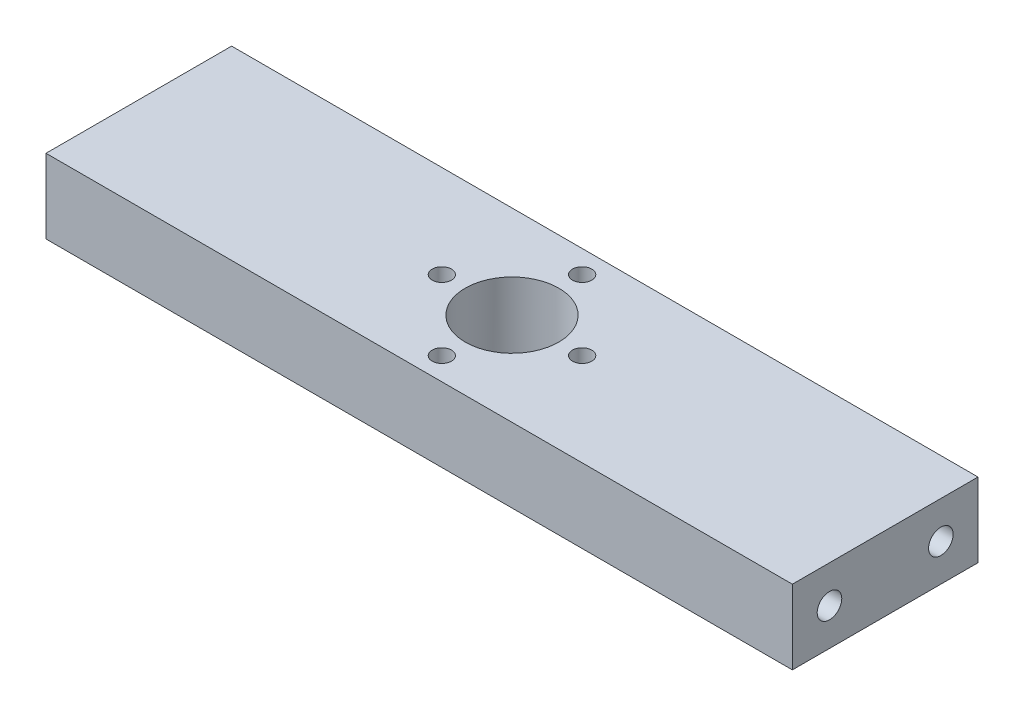
ISO-10303-21;
HEADER;
FILE_DESCRIPTION(('STEP AP214'),'2;1');
FILE_NAME('part.step','',(''),(''),'','','');
FILE_SCHEMA(('AUTOMOTIVE_DESIGN { 1 0 10303 214 1 1 1 1 }'));
ENDSEC;
DATA;
#1=APPLICATION_CONTEXT('core data for automotive mechanical design processes');
#2=APPLICATION_PROTOCOL_DEFINITION('international standard','automotive_design',2000,#1);
#3=PRODUCT_CONTEXT('',#1,'mechanical');
#4=PRODUCT('Part','Part','',(#3));
#5=PRODUCT_RELATED_PRODUCT_CATEGORY('part','',(#4));
#6=PRODUCT_DEFINITION_FORMATION('','',#4);
#7=PRODUCT_DEFINITION_CONTEXT('part definition',#1,'design');
#8=PRODUCT_DEFINITION('design','',#6,#7);
#9=PRODUCT_DEFINITION_SHAPE('','',#8);
#10=(LENGTH_UNIT() NAMED_UNIT(*) SI_UNIT(.MILLI.,.METRE.));
#11=(NAMED_UNIT(*) PLANE_ANGLE_UNIT() SI_UNIT($,.RADIAN.));
#12=(NAMED_UNIT(*) SI_UNIT($,.STERADIAN.) SOLID_ANGLE_UNIT());
#13=UNCERTAINTY_MEASURE_WITH_UNIT(LENGTH_MEASURE(1.E-05),#10,'distance_accuracy_value','');
#14=(GEOMETRIC_REPRESENTATION_CONTEXT(3) GLOBAL_UNCERTAINTY_ASSIGNED_CONTEXT((#13)) GLOBAL_UNIT_ASSIGNED_CONTEXT((#10,
#11,#12)) REPRESENTATION_CONTEXT('',''));
#15=CARTESIAN_POINT('',(0.,0.,0.));
#16=DIRECTION('',(0.,0.,1.));
#17=DIRECTION('',(1.,0.,0.));
#18=AXIS2_PLACEMENT_3D('',#15,#16,#17);
#19=CARTESIAN_POINT('',(0.,6.35,0.));
#20=DIRECTION('',(0.,-1.,0.));
#21=DIRECTION('',(0.,0.,-1.));
#22=AXIS2_PLACEMENT_3D('',#19,#20,#21);
#23=PLANE('',#22);
#24=CARTESIAN_POINT('',(0.,6.35,-12.));
#25=DIRECTION('',(0.,1.,0.));
#26=DIRECTION('',(0.,0.,1.));
#27=AXIS2_PLACEMENT_3D('',#24,#25,#26);
#28=CIRCLE('',#27,1.65);
#29=CARTESIAN_POINT('',(0.,6.35,-10.35));
#30=VERTEX_POINT('',#29);
#31=EDGE_CURVE('E205',#30,#30,#28,.T.);
#32=ORIENTED_EDGE('',*,*,#31,.F.);
#33=EDGE_LOOP('',(#32));
#34=FACE_BOUND('',#33,.T.);
#35=CARTESIAN_POINT('',(-12.,6.35,0.));
#36=DIRECTION('',(0.,1.,0.));
#37=DIRECTION('',(0.,0.,1.));
#38=AXIS2_PLACEMENT_3D('',#35,#36,#37);
#39=CIRCLE('',#38,1.65);
#40=CARTESIAN_POINT('',(-12.,6.35,1.65));
#41=VERTEX_POINT('',#40);
#42=EDGE_CURVE('E202',#41,#41,#39,.T.);
#43=ORIENTED_EDGE('',*,*,#42,.F.);
#44=EDGE_LOOP('',(#43));
#45=FACE_BOUND('',#44,.T.);
#46=CARTESIAN_POINT('',(0.,6.35,12.));
#47=DIRECTION('',(0.,1.,0.));
#48=DIRECTION('',(0.,0.,1.));
#49=AXIS2_PLACEMENT_3D('',#46,#47,#48);
#50=CIRCLE('',#49,1.65);
#51=CARTESIAN_POINT('',(0.,6.35,13.65));
#52=VERTEX_POINT('',#51);
#53=EDGE_CURVE('E216',#52,#52,#50,.T.);
#54=ORIENTED_EDGE('',*,*,#53,.F.);
#55=EDGE_LOOP('',(#54));
#56=FACE_BOUND('',#55,.T.);
#57=CARTESIAN_POINT('',(0.,6.35,0.));
#58=DIRECTION('',(0.,1.,0.));
#59=DIRECTION('',(0.,0.,1.));
#60=AXIS2_PLACEMENT_3D('',#57,#58,#59);
#61=CIRCLE('',#60,8.);
#62=CARTESIAN_POINT('',(0.,6.35,8.));
#63=VERTEX_POINT('',#62);
#64=EDGE_CURVE('E224',#63,#63,#61,.T.);
#65=ORIENTED_EDGE('',*,*,#64,.F.);
#66=EDGE_LOOP('',(#65));
#67=FACE_BOUND('',#66,.T.);
#68=DIRECTION('',(0.,0.,-1.));
#69=VECTOR('',#68,1.);
#70=CARTESIAN_POINT('',(-63.830000102,6.35,15.875));
#71=LINE('',#70,#69);
#72=CARTESIAN_POINT('',(-63.830000102,6.35,15.875));
#73=VERTEX_POINT('',#72);
#74=CARTESIAN_POINT('',(-63.830000102,6.35,-15.875));
#75=VERTEX_POINT('',#74);
#76=EDGE_CURVE('E147',#73,#75,#71,.T.);
#77=ORIENTED_EDGE('',*,*,#76,.F.);
#78=DIRECTION('',(1.,0.,0.));
#79=VECTOR('',#78,1.);
#80=CARTESIAN_POINT('',(-63.830000102,6.35,15.875));
#81=LINE('',#80,#79);
#82=CARTESIAN_POINT('',(63.830000102,6.35,15.875));
#83=VERTEX_POINT('',#82);
#84=EDGE_CURVE('E156',#73,#83,#81,.T.);
#85=ORIENTED_EDGE('',*,*,#84,.T.);
#86=DIRECTION('',(0.,0.,-1.));
#87=VECTOR('',#86,1.);
#88=CARTESIAN_POINT('',(63.830000102,6.35,15.875));
#89=LINE('',#88,#87);
#90=CARTESIAN_POINT('',(63.830000102,6.35,-15.875));
#91=VERTEX_POINT('',#90);
#92=EDGE_CURVE('E153',#83,#91,#89,.T.);
#93=ORIENTED_EDGE('',*,*,#92,.T.);
#94=DIRECTION('',(1.,0.,0.));
#95=VECTOR('',#94,1.);
#96=CARTESIAN_POINT('',(-63.830000102,6.35,-15.875));
#97=LINE('',#96,#95);
#98=EDGE_CURVE('E150',#75,#91,#97,.T.);
#99=ORIENTED_EDGE('',*,*,#98,.F.);
#100=EDGE_LOOP('',(#77,#85,#93,#99));
#101=FACE_BOUND('',#100,.T.);
#102=CARTESIAN_POINT('',(12.,6.35,0.));
#103=DIRECTION('',(0.,1.,0.));
#104=DIRECTION('',(0.,0.,1.));
#105=AXIS2_PLACEMENT_3D('',#102,#103,#104);
#106=CIRCLE('',#105,1.65);
#107=CARTESIAN_POINT('',(12.,6.35,1.65));
#108=VERTEX_POINT('',#107);
#109=EDGE_CURVE('E193',#108,#108,#106,.T.);
#110=ORIENTED_EDGE('',*,*,#109,.F.);
#111=EDGE_LOOP('',(#110));
#112=FACE_BOUND('',#111,.T.);
#113=ADVANCED_FACE('F45',(#34,#45,#56,#67,#101,#112),#23,.F.);
#114=CARTESIAN_POINT('',(-63.830000102,6.35,15.875));
#115=DIRECTION('',(-1.,0.,0.));
#116=DIRECTION('',(0.,0.,1.));
#117=AXIS2_PLACEMENT_3D('',#114,#115,#116);
#118=PLANE('',#117);
#119=CARTESIAN_POINT('',(-63.830000102,0.,9.525));
#120=DIRECTION('',(-1.,0.,0.));
#121=DIRECTION('',(0.,0.,1.));
#122=AXIS2_PLACEMENT_3D('',#119,#120,#121);
#123=CIRCLE('',#122,2.1);
#124=CARTESIAN_POINT('',(-63.830000102,0.,11.625));
#125=VERTEX_POINT('',#124);
#126=EDGE_CURVE('E130',#125,#125,#123,.T.);
#127=ORIENTED_EDGE('',*,*,#126,.F.);
#128=EDGE_LOOP('',(#127));
#129=FACE_BOUND('',#128,.T.);
#130=CARTESIAN_POINT('',(-63.830000102,0.,-9.525));
#131=DIRECTION('',(-1.,0.,0.));
#132=DIRECTION('',(0.,0.,1.));
#133=AXIS2_PLACEMENT_3D('',#130,#131,#132);
#134=CIRCLE('',#133,2.1);
#135=CARTESIAN_POINT('',(-63.830000102,0.,-7.425));
#136=VERTEX_POINT('',#135);
#137=EDGE_CURVE('E138',#136,#136,#134,.T.);
#138=ORIENTED_EDGE('',*,*,#137,.F.);
#139=EDGE_LOOP('',(#138));
#140=FACE_BOUND('',#139,.T.);
#141=DIRECTION('',(0.,0.,-1.));
#142=VECTOR('',#141,1.);
#143=CARTESIAN_POINT('',(-63.830000102,-6.35,15.875));
#144=LINE('',#143,#142);
#145=CARTESIAN_POINT('',(-63.830000102,-6.35,15.875));
#146=VERTEX_POINT('',#145);
#147=CARTESIAN_POINT('',(-63.830000102,-6.35,-15.875));
#148=VERTEX_POINT('',#147);
#149=EDGE_CURVE('E146',#146,#148,#144,.T.);
#150=ORIENTED_EDGE('',*,*,#149,.F.);
#151=DIRECTION('',(0.,-1.,0.));
#152=VECTOR('',#151,1.);
#153=CARTESIAN_POINT('',(-63.830000102,6.35,15.875));
#154=LINE('',#153,#152);
#155=EDGE_CURVE('E11',#73,#146,#154,.T.);
#156=ORIENTED_EDGE('',*,*,#155,.F.);
#157=ORIENTED_EDGE('',*,*,#76,.T.);
#158=DIRECTION('',(0.,-1.,0.));
#159=VECTOR('',#158,1.);
#160=CARTESIAN_POINT('',(-63.830000102,6.35,-15.875));
#161=LINE('',#160,#159);
#162=EDGE_CURVE('E49',#75,#148,#161,.T.);
#163=ORIENTED_EDGE('',*,*,#162,.T.);
#164=EDGE_LOOP('',(#150,#156,#157,#163));
#165=FACE_BOUND('',#164,.T.);
#166=ADVANCED_FACE('F47',(#129,#140,#165),#118,.T.);
#167=CARTESIAN_POINT('',(-63.830000102,6.35,15.875));
#168=DIRECTION('',(0.,0.,-1.));
#169=DIRECTION('',(-1.,0.,0.));
#170=AXIS2_PLACEMENT_3D('',#167,#168,#169);
#171=PLANE('',#170);
#172=DIRECTION('',(1.,0.,0.));
#173=VECTOR('',#172,1.);
#174=CARTESIAN_POINT('',(-63.830000102,-6.35,15.875));
#175=LINE('',#174,#173);
#176=CARTESIAN_POINT('',(63.830000102,-6.35,15.875));
#177=VERTEX_POINT('',#176);
#178=EDGE_CURVE('E81',#146,#177,#175,.T.);
#179=ORIENTED_EDGE('',*,*,#178,.T.);
#180=DIRECTION('',(0.,-1.,0.));
#181=VECTOR('',#180,1.);
#182=CARTESIAN_POINT('',(63.830000102,6.35,15.875));
#183=LINE('',#182,#181);
#184=EDGE_CURVE('E56',#83,#177,#183,.T.);
#185=ORIENTED_EDGE('',*,*,#184,.F.);
#186=ORIENTED_EDGE('',*,*,#84,.F.);
#187=ORIENTED_EDGE('',*,*,#155,.T.);
#188=EDGE_LOOP('',(#179,#185,#186,#187));
#189=FACE_BOUND('',#188,.T.);
#190=ADVANCED_FACE('F185',(#189),#171,.F.);
#191=CARTESIAN_POINT('',(63.830000102,6.35,15.875));
#192=DIRECTION('',(-1.,0.,0.));
#193=DIRECTION('',(0.,0.,1.));
#194=AXIS2_PLACEMENT_3D('',#191,#192,#193);
#195=PLANE('',#194);
#196=CARTESIAN_POINT('',(63.830000102,0.,9.525));
#197=DIRECTION('',(1.,0.,0.));
#198=DIRECTION('',(0.,0.,-1.));
#199=AXIS2_PLACEMENT_3D('',#196,#197,#198);
#200=CIRCLE('',#199,2.1);
#201=CARTESIAN_POINT('',(63.830000102,0.,7.425));
#202=VERTEX_POINT('',#201);
#203=EDGE_CURVE('E115',#202,#202,#200,.T.);
#204=ORIENTED_EDGE('',*,*,#203,.F.);
#205=EDGE_LOOP('',(#204));
#206=FACE_BOUND('',#205,.T.);
#207=CARTESIAN_POINT('',(63.830000102,0.,-9.525));
#208=DIRECTION('',(1.,0.,0.));
#209=DIRECTION('',(0.,0.,-1.));
#210=AXIS2_PLACEMENT_3D('',#207,#208,#209);
#211=CIRCLE('',#210,2.1);
#212=CARTESIAN_POINT('',(63.830000102,0.,-11.625));
#213=VERTEX_POINT('',#212);
#214=EDGE_CURVE('E114',#213,#213,#211,.T.);
#215=ORIENTED_EDGE('',*,*,#214,.F.);
#216=EDGE_LOOP('',(#215));
#217=FACE_BOUND('',#216,.T.);
#218=DIRECTION('',(0.,0.,-1.));
#219=VECTOR('',#218,1.);
#220=CARTESIAN_POINT('',(63.830000102,-6.35,15.875));
#221=LINE('',#220,#219);
#222=CARTESIAN_POINT('',(63.830000102,-6.35,-15.875));
#223=VERTEX_POINT('',#222);
#224=EDGE_CURVE('E166',#177,#223,#221,.T.);
#225=ORIENTED_EDGE('',*,*,#224,.T.);
#226=DIRECTION('',(0.,-1.,0.));
#227=VECTOR('',#226,1.);
#228=CARTESIAN_POINT('',(63.830000102,6.35,-15.875));
#229=LINE('',#228,#227);
#230=EDGE_CURVE('E173',#91,#223,#229,.T.);
#231=ORIENTED_EDGE('',*,*,#230,.F.);
#232=ORIENTED_EDGE('',*,*,#92,.F.);
#233=ORIENTED_EDGE('',*,*,#184,.T.);
#234=EDGE_LOOP('',(#225,#231,#232,#233));
#235=FACE_BOUND('',#234,.T.);
#236=ADVANCED_FACE('F183',(#206,#217,#235),#195,.F.);
#237=CARTESIAN_POINT('',(-63.830000102,6.35,-15.875));
#238=DIRECTION('',(0.,0.,-1.));
#239=DIRECTION('',(-1.,0.,0.));
#240=AXIS2_PLACEMENT_3D('',#237,#238,#239);
#241=PLANE('',#240);
#242=DIRECTION('',(1.,0.,0.));
#243=VECTOR('',#242,1.);
#244=CARTESIAN_POINT('',(-63.830000102,-6.35,-15.875));
#245=LINE('',#244,#243);
#246=EDGE_CURVE('E162',#148,#223,#245,.T.);
#247=ORIENTED_EDGE('',*,*,#246,.F.);
#248=ORIENTED_EDGE('',*,*,#162,.F.);
#249=ORIENTED_EDGE('',*,*,#98,.T.);
#250=ORIENTED_EDGE('',*,*,#230,.T.);
#251=EDGE_LOOP('',(#247,#248,#249,#250));
#252=FACE_BOUND('',#251,.T.);
#253=ADVANCED_FACE('F178',(#252),#241,.T.);
#254=CARTESIAN_POINT('',(0.,-6.35,0.));
#255=DIRECTION('',(0.,-1.,0.));
#256=DIRECTION('',(0.,0.,-1.));
#257=AXIS2_PLACEMENT_3D('',#254,#255,#256);
#258=PLANE('',#257);
#259=CARTESIAN_POINT('',(0.,-6.35,-12.));
#260=DIRECTION('',(0.,-1.,0.));
#261=DIRECTION('',(0.,0.,-1.));
#262=AXIS2_PLACEMENT_3D('',#259,#260,#261);
#263=CIRCLE('',#262,1.65);
#264=CARTESIAN_POINT('',(0.,-6.35,-13.65));
#265=VERTEX_POINT('',#264);
#266=EDGE_CURVE('E197',#265,#265,#263,.T.);
#267=ORIENTED_EDGE('',*,*,#266,.F.);
#268=EDGE_LOOP('',(#267));
#269=FACE_BOUND('',#268,.T.);
#270=CARTESIAN_POINT('',(12.,-6.35,0.));
#271=DIRECTION('',(0.,-1.,0.));
#272=DIRECTION('',(0.,0.,-1.));
#273=AXIS2_PLACEMENT_3D('',#270,#271,#272);
#274=CIRCLE('',#273,1.65);
#275=CARTESIAN_POINT('',(12.,-6.35,-1.65));
#276=VERTEX_POINT('',#275);
#277=EDGE_CURVE('E196',#276,#276,#274,.T.);
#278=ORIENTED_EDGE('',*,*,#277,.F.);
#279=EDGE_LOOP('',(#278));
#280=FACE_BOUND('',#279,.T.);
#281=CARTESIAN_POINT('',(-12.,-6.35,0.));
#282=DIRECTION('',(0.,-1.,0.));
#283=DIRECTION('',(0.,0.,-1.));
#284=AXIS2_PLACEMENT_3D('',#281,#282,#283);
#285=CIRCLE('',#284,1.65);
#286=CARTESIAN_POINT('',(-12.,-6.35,-1.65));
#287=VERTEX_POINT('',#286);
#288=EDGE_CURVE('E212',#287,#287,#285,.T.);
#289=ORIENTED_EDGE('',*,*,#288,.F.);
#290=EDGE_LOOP('',(#289));
#291=FACE_BOUND('',#290,.T.);
#292=CARTESIAN_POINT('',(0.,-6.35,12.));
#293=DIRECTION('',(0.,-1.,0.));
#294=DIRECTION('',(0.,0.,-1.));
#295=AXIS2_PLACEMENT_3D('',#292,#293,#294);
#296=CIRCLE('',#295,1.65);
#297=CARTESIAN_POINT('',(0.,-6.35,10.35));
#298=VERTEX_POINT('',#297);
#299=EDGE_CURVE('E220',#298,#298,#296,.T.);
#300=ORIENTED_EDGE('',*,*,#299,.F.);
#301=EDGE_LOOP('',(#300));
#302=FACE_BOUND('',#301,.T.);
#303=CARTESIAN_POINT('',(0.,-6.35,0.));
#304=DIRECTION('',(0.,-1.,0.));
#305=DIRECTION('',(0.,0.,-1.));
#306=AXIS2_PLACEMENT_3D('',#303,#304,#305);
#307=CIRCLE('',#306,8.);
#308=CARTESIAN_POINT('',(0.,-6.35,-8.));
#309=VERTEX_POINT('',#308);
#310=EDGE_CURVE('E123',#309,#309,#307,.T.);
#311=ORIENTED_EDGE('',*,*,#310,.F.);
#312=EDGE_LOOP('',(#311));
#313=FACE_BOUND('',#312,.T.);
#314=ORIENTED_EDGE('',*,*,#149,.T.);
#315=ORIENTED_EDGE('',*,*,#246,.T.);
#316=ORIENTED_EDGE('',*,*,#224,.F.);
#317=ORIENTED_EDGE('',*,*,#178,.F.);
#318=EDGE_LOOP('',(#314,#315,#316,#317));
#319=FACE_BOUND('',#318,.T.);
#320=ADVANCED_FACE('F181',(#269,#280,#291,#302,#313,#319),#258,.T.);
#321=CARTESIAN_POINT('',(-52.8998074019579,0.,-9.525));
#322=DIRECTION('',(-1.,0.,0.));
#323=DIRECTION('',(0.,0.,1.));
#324=AXIS2_PLACEMENT_3D('',#321,#322,#323);
#325=CONICAL_SURFACE('',#324,2.1,1.02974425867665);
#326=CARTESIAN_POINT('',(-51.638000102,0.,-9.525));
#327=VERTEX_POINT('',#326);
#328=VERTEX_LOOP('',#327);
#329=FACE_BOUND('',#328,.T.);
#330=CARTESIAN_POINT('',(-52.8998074019579,0.,-9.525));
#331=DIRECTION('',(-1.,0.,0.));
#332=DIRECTION('',(0.,0.,1.));
#333=AXIS2_PLACEMENT_3D('',#330,#331,#332);
#334=CIRCLE('',#333,2.1);
#335=CARTESIAN_POINT('',(-52.8998074019579,0.,-7.425));
#336=VERTEX_POINT('',#335);
#337=EDGE_CURVE('E142',#336,#336,#334,.T.);
#338=ORIENTED_EDGE('',*,*,#337,.T.);
#339=EDGE_LOOP('',(#338));
#340=FACE_BOUND('',#339,.T.);
#341=ADVANCED_FACE('F234',(#329,#340),#325,.F.);
#342=CARTESIAN_POINT('',(-63.830000102,0.,-9.525));
#343=DIRECTION('',(-1.,0.,0.));
#344=DIRECTION('',(0.,0.,1.));
#345=AXIS2_PLACEMENT_3D('',#342,#343,#344);
#346=CYLINDRICAL_SURFACE('',#345,2.1);
#347=ORIENTED_EDGE('',*,*,#337,.F.);
#348=EDGE_LOOP('',(#347));
#349=FACE_BOUND('',#348,.T.);
#350=ORIENTED_EDGE('',*,*,#137,.T.);
#351=EDGE_LOOP('',(#350));
#352=FACE_BOUND('',#351,.T.);
#353=ADVANCED_FACE('F241',(#349,#352),#346,.F.);
#354=CARTESIAN_POINT('',(-52.8998074019579,0.,9.525));
#355=DIRECTION('',(-1.,0.,0.));
#356=DIRECTION('',(0.,0.,1.));
#357=AXIS2_PLACEMENT_3D('',#354,#355,#356);
#358=CONICAL_SURFACE('',#357,2.1,1.02974425867665);
#359=CARTESIAN_POINT('',(-51.638000102,0.,9.525));
#360=VERTEX_POINT('',#359);
#361=VERTEX_LOOP('',#360);
#362=FACE_BOUND('',#361,.T.);
#363=CARTESIAN_POINT('',(-52.8998074019579,0.,9.525));
#364=DIRECTION('',(-1.,0.,0.));
#365=DIRECTION('',(0.,0.,1.));
#366=AXIS2_PLACEMENT_3D('',#363,#364,#365);
#367=CIRCLE('',#366,2.1);
#368=CARTESIAN_POINT('',(-52.8998074019579,0.,11.625));
#369=VERTEX_POINT('',#368);
#370=EDGE_CURVE('E134',#369,#369,#367,.T.);
#371=ORIENTED_EDGE('',*,*,#370,.T.);
#372=EDGE_LOOP('',(#371));
#373=FACE_BOUND('',#372,.T.);
#374=ADVANCED_FACE('F272',(#362,#373),#358,.F.);
#375=CARTESIAN_POINT('',(-63.830000102,0.,9.525));
#376=DIRECTION('',(-1.,0.,0.));
#377=DIRECTION('',(0.,0.,1.));
#378=AXIS2_PLACEMENT_3D('',#375,#376,#377);
#379=CYLINDRICAL_SURFACE('',#378,2.1);
#380=ORIENTED_EDGE('',*,*,#370,.F.);
#381=EDGE_LOOP('',(#380));
#382=FACE_BOUND('',#381,.T.);
#383=ORIENTED_EDGE('',*,*,#126,.T.);
#384=EDGE_LOOP('',(#383));
#385=FACE_BOUND('',#384,.T.);
#386=ADVANCED_FACE('F264',(#382,#385),#379,.F.);
#387=CARTESIAN_POINT('',(52.8998074019579,0.,-9.525));
#388=DIRECTION('',(1.,0.,0.));
#389=DIRECTION('',(0.,0.,-1.));
#390=AXIS2_PLACEMENT_3D('',#387,#388,#389);
#391=CONICAL_SURFACE('',#390,2.1,1.02974425867665);
#392=CARTESIAN_POINT('',(51.638000102,0.,-9.525));
#393=VERTEX_POINT('',#392);
#394=VERTEX_LOOP('',#393);
#395=FACE_BOUND('',#394,.T.);
#396=CARTESIAN_POINT('',(52.8998074019579,0.,-9.525));
#397=DIRECTION('',(1.,0.,0.));
#398=DIRECTION('',(0.,0.,-1.));
#399=AXIS2_PLACEMENT_3D('',#396,#397,#398);
#400=CIRCLE('',#399,2.1);
#401=CARTESIAN_POINT('',(52.8998074019579,0.,-11.625));
#402=VERTEX_POINT('',#401);
#403=EDGE_CURVE('E120',#402,#402,#400,.T.);
#404=ORIENTED_EDGE('',*,*,#403,.T.);
#405=EDGE_LOOP('',(#404));
#406=FACE_BOUND('',#405,.T.);
#407=ADVANCED_FACE('F258',(#395,#406),#391,.F.);
#408=CARTESIAN_POINT('',(63.830000102,0.,-9.525));
#409=DIRECTION('',(1.,0.,0.));
#410=DIRECTION('',(0.,0.,-1.));
#411=AXIS2_PLACEMENT_3D('',#408,#409,#410);
#412=CYLINDRICAL_SURFACE('',#411,2.1);
#413=ORIENTED_EDGE('',*,*,#403,.F.);
#414=EDGE_LOOP('',(#413));
#415=FACE_BOUND('',#414,.T.);
#416=ORIENTED_EDGE('',*,*,#214,.T.);
#417=EDGE_LOOP('',(#416));
#418=FACE_BOUND('',#417,.T.);
#419=ADVANCED_FACE('F107',(#415,#418),#412,.F.);
#420=CARTESIAN_POINT('',(52.8998074019579,0.,9.525));
#421=DIRECTION('',(1.,0.,0.));
#422=DIRECTION('',(0.,0.,-1.));
#423=AXIS2_PLACEMENT_3D('',#420,#421,#422);
#424=CONICAL_SURFACE('',#423,2.1,1.02974425867665);
#425=CARTESIAN_POINT('',(51.638000102,0.,9.525));
#426=VERTEX_POINT('',#425);
#427=VERTEX_LOOP('',#426);
#428=FACE_BOUND('',#427,.T.);
#429=CARTESIAN_POINT('',(52.8998074019579,0.,9.525));
#430=DIRECTION('',(1.,0.,0.));
#431=DIRECTION('',(0.,0.,-1.));
#432=AXIS2_PLACEMENT_3D('',#429,#430,#431);
#433=CIRCLE('',#432,2.1);
#434=CARTESIAN_POINT('',(52.8998074019579,0.,7.425));
#435=VERTEX_POINT('',#434);
#436=EDGE_CURVE('E111',#435,#435,#433,.T.);
#437=ORIENTED_EDGE('',*,*,#436,.T.);
#438=EDGE_LOOP('',(#437));
#439=FACE_BOUND('',#438,.T.);
#440=ADVANCED_FACE('F103',(#428,#439),#424,.F.);
#441=CARTESIAN_POINT('',(63.830000102,0.,9.525));
#442=DIRECTION('',(1.,0.,0.));
#443=DIRECTION('',(0.,0.,-1.));
#444=AXIS2_PLACEMENT_3D('',#441,#442,#443);
#445=CYLINDRICAL_SURFACE('',#444,2.1);
#446=ORIENTED_EDGE('',*,*,#436,.F.);
#447=EDGE_LOOP('',(#446));
#448=FACE_BOUND('',#447,.T.);
#449=ORIENTED_EDGE('',*,*,#203,.T.);
#450=EDGE_LOOP('',(#449));
#451=FACE_BOUND('',#450,.T.);
#452=ADVANCED_FACE('F106',(#448,#451),#445,.F.);
#453=CARTESIAN_POINT('',(0.,6.35,0.));
#454=DIRECTION('',(0.,1.,0.));
#455=DIRECTION('',(0.,0.,1.));
#456=AXIS2_PLACEMENT_3D('',#453,#454,#455);
#457=CYLINDRICAL_SURFACE('',#456,8.);
#458=ORIENTED_EDGE('',*,*,#64,.T.);
#459=EDGE_LOOP('',(#458));
#460=FACE_BOUND('',#459,.T.);
#461=ORIENTED_EDGE('',*,*,#310,.T.);
#462=EDGE_LOOP('',(#461));
#463=FACE_BOUND('',#462,.T.);
#464=ADVANCED_FACE('F231',(#460,#463),#457,.F.);
#465=CARTESIAN_POINT('',(0.,6.35,12.));
#466=DIRECTION('',(0.,1.,0.));
#467=DIRECTION('',(0.,0.,1.));
#468=AXIS2_PLACEMENT_3D('',#465,#466,#467);
#469=CYLINDRICAL_SURFACE('',#468,1.65);
#470=ORIENTED_EDGE('',*,*,#53,.T.);
#471=EDGE_LOOP('',(#470));
#472=FACE_BOUND('',#471,.T.);
#473=ORIENTED_EDGE('',*,*,#299,.T.);
#474=EDGE_LOOP('',(#473));
#475=FACE_BOUND('',#474,.T.);
#476=ADVANCED_FACE('F389',(#472,#475),#469,.F.);
#477=CARTESIAN_POINT('',(-12.,6.35,0.));
#478=DIRECTION('',(0.,1.,0.));
#479=DIRECTION('',(0.,0.,1.));
#480=AXIS2_PLACEMENT_3D('',#477,#478,#479);
#481=CYLINDRICAL_SURFACE('',#480,1.65);
#482=ORIENTED_EDGE('',*,*,#42,.T.);
#483=EDGE_LOOP('',(#482));
#484=FACE_BOUND('',#483,.T.);
#485=ORIENTED_EDGE('',*,*,#288,.T.);
#486=EDGE_LOOP('',(#485));
#487=FACE_BOUND('',#486,.T.);
#488=ADVANCED_FACE('F407',(#484,#487),#481,.F.);
#489=CARTESIAN_POINT('',(12.,6.35,0.));
#490=DIRECTION('',(0.,1.,0.));
#491=DIRECTION('',(0.,0.,1.));
#492=AXIS2_PLACEMENT_3D('',#489,#490,#491);
#493=CYLINDRICAL_SURFACE('',#492,1.65);
#494=ORIENTED_EDGE('',*,*,#109,.T.);
#495=EDGE_LOOP('',(#494));
#496=FACE_BOUND('',#495,.T.);
#497=ORIENTED_EDGE('',*,*,#277,.T.);
#498=EDGE_LOOP('',(#497));
#499=FACE_BOUND('',#498,.T.);
#500=ADVANCED_FACE('F417',(#496,#499),#493,.F.);
#501=CARTESIAN_POINT('',(0.,6.35,-12.));
#502=DIRECTION('',(0.,1.,0.));
#503=DIRECTION('',(0.,0.,1.));
#504=AXIS2_PLACEMENT_3D('',#501,#502,#503);
#505=CYLINDRICAL_SURFACE('',#504,1.65);
#506=ORIENTED_EDGE('',*,*,#31,.T.);
#507=EDGE_LOOP('',(#506));
#508=FACE_BOUND('',#507,.T.);
#509=ORIENTED_EDGE('',*,*,#266,.T.);
#510=EDGE_LOOP('',(#509));
#511=FACE_BOUND('',#510,.T.);
#512=ADVANCED_FACE('F427',(#508,#511),#505,.F.);
#513=CLOSED_SHELL('',(#113,#166,#190,#236,#253,#320,#341,#353,#374,#386,#407,#419,#440,#452,
#464,#476,#488,#500,#512));
#514=MANIFOLD_SOLID_BREP('B2',#513);
#515=ADVANCED_BREP_SHAPE_REPRESENTATION('',(#18,#514),#14);
#516=SHAPE_DEFINITION_REPRESENTATION(#9,#515);
ENDSEC;
END-ISO-10303-21;
